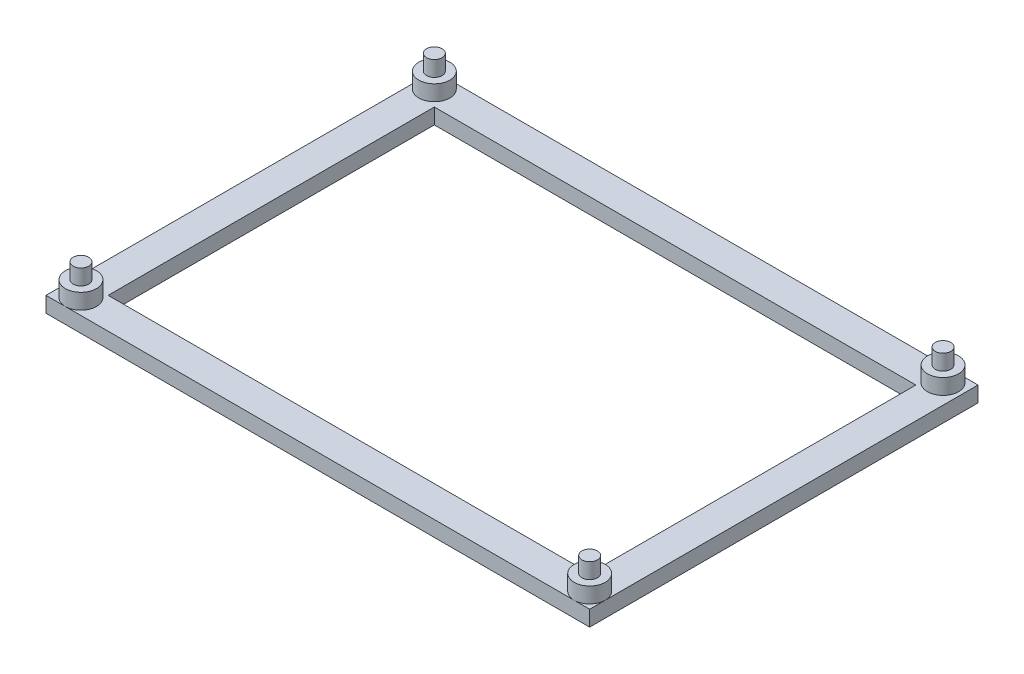
ISO-10303-21;
HEADER;
FILE_DESCRIPTION(('STEP AP214'),'2;1');
FILE_NAME('part.step','',(''),(''),'','','');
FILE_SCHEMA(('AUTOMOTIVE_DESIGN { 1 0 10303 214 1 1 1 1 }'));
ENDSEC;
DATA;
#1=APPLICATION_CONTEXT('core data for automotive mechanical design processes');
#2=APPLICATION_PROTOCOL_DEFINITION('international standard','automotive_design',2000,#1);
#3=PRODUCT_CONTEXT('',#1,'mechanical');
#4=PRODUCT('Part','Part','',(#3));
#5=PRODUCT_RELATED_PRODUCT_CATEGORY('part','',(#4));
#6=PRODUCT_DEFINITION_FORMATION('','',#4);
#7=PRODUCT_DEFINITION_CONTEXT('part definition',#1,'design');
#8=PRODUCT_DEFINITION('design','',#6,#7);
#9=PRODUCT_DEFINITION_SHAPE('','',#8);
#10=(LENGTH_UNIT() NAMED_UNIT(*) SI_UNIT(.MILLI.,.METRE.));
#11=(NAMED_UNIT(*) PLANE_ANGLE_UNIT() SI_UNIT($,.RADIAN.));
#12=(NAMED_UNIT(*) SI_UNIT($,.STERADIAN.) SOLID_ANGLE_UNIT());
#13=UNCERTAINTY_MEASURE_WITH_UNIT(LENGTH_MEASURE(1.E-05),#10,'distance_accuracy_value','');
#14=(GEOMETRIC_REPRESENTATION_CONTEXT(3) GLOBAL_UNCERTAINTY_ASSIGNED_CONTEXT((#13)) GLOBAL_UNIT_ASSIGNED_CONTEXT((#10,
#11,#12)) REPRESENTATION_CONTEXT('',''));
#15=CARTESIAN_POINT('',(0.,0.,0.));
#16=DIRECTION('',(0.,0.,1.));
#17=DIRECTION('',(1.,0.,0.));
#18=AXIS2_PLACEMENT_3D('',#15,#16,#17);
#19=CARTESIAN_POINT('',(0.,2.,0.));
#20=DIRECTION('',(0.,-1.,0.));
#21=DIRECTION('',(0.,0.,-1.));
#22=AXIS2_PLACEMENT_3D('',#19,#20,#21);
#23=PLANE('',#22);
#24=CARTESIAN_POINT('',(33.,2.,23.));
#25=DIRECTION('',(0.,1.,0.));
#26=DIRECTION('',(0.,0.,1.));
#27=AXIS2_PLACEMENT_3D('',#24,#25,#26);
#28=CIRCLE('',#27,2.);
#29=CARTESIAN_POINT('',(33.,2.,25.));
#30=VERTEX_POINT('',#29);
#31=CARTESIAN_POINT('',(35.,2.,23.));
#32=VERTEX_POINT('',#31);
#33=EDGE_CURVE('E188',#30,#32,#28,.T.);
#34=ORIENTED_EDGE('',*,*,#33,.F.);
#35=DIRECTION('',(1.,0.,0.));
#36=VECTOR('',#35,1.);
#37=CARTESIAN_POINT('',(-35.,2.,25.));
#38=LINE('',#37,#36);
#39=CARTESIAN_POINT('',(35.,2.,25.));
#40=VERTEX_POINT('',#39);
#41=EDGE_CURVE('E244',#30,#40,#38,.T.);
#42=ORIENTED_EDGE('',*,*,#41,.T.);
#43=DIRECTION('',(0.,0.,-1.));
#44=VECTOR('',#43,1.);
#45=CARTESIAN_POINT('',(35.,2.,25.));
#46=LINE('',#45,#44);
#47=EDGE_CURVE('E229',#40,#32,#46,.T.);
#48=ORIENTED_EDGE('',*,*,#47,.T.);
#49=EDGE_LOOP('',(#34,#42,#48));
#50=FACE_BOUND('',#49,.T.);
#51=ADVANCED_FACE('F41',(#50),#23,.F.);
#52=CARTESIAN_POINT('',(-33.,2.,-23.));
#53=DIRECTION('',(0.,1.,0.));
#54=DIRECTION('',(0.,0.,1.));
#55=AXIS2_PLACEMENT_3D('',#52,#53,#54);
#56=CIRCLE('',#55,2.);
#57=CARTESIAN_POINT('',(-33.,2.,-25.));
#58=VERTEX_POINT('',#57);
#59=CARTESIAN_POINT('',(-35.,2.,-23.));
#60=VERTEX_POINT('',#59);
#61=EDGE_CURVE('E207',#58,#60,#56,.T.);
#62=ORIENTED_EDGE('',*,*,#61,.F.);
#63=DIRECTION('',(-1.,0.,0.));
#64=VECTOR('',#63,1.);
#65=CARTESIAN_POINT('',(-35.,2.,-25.));
#66=LINE('',#65,#64);
#67=CARTESIAN_POINT('',(-35.,2.,-25.));
#68=VERTEX_POINT('',#67);
#69=EDGE_CURVE('E233',#58,#68,#66,.T.);
#70=ORIENTED_EDGE('',*,*,#69,.T.);
#71=DIRECTION('',(0.,0.,1.));
#72=VECTOR('',#71,1.);
#73=CARTESIAN_POINT('',(-35.,2.,25.));
#74=LINE('',#73,#72);
#75=EDGE_CURVE('E240',#68,#60,#74,.T.);
#76=ORIENTED_EDGE('',*,*,#75,.T.);
#77=EDGE_LOOP('',(#62,#70,#76));
#78=FACE_BOUND('',#77,.T.);
#79=ADVANCED_FACE('F327',(#78),#23,.F.);
#80=CARTESIAN_POINT('',(35.,2.,25.));
#81=DIRECTION('',(-1.,0.,0.));
#82=DIRECTION('',(0.,0.,1.));
#83=AXIS2_PLACEMENT_3D('',#80,#81,#82);
#84=PLANE('',#83);
#85=DIRECTION('',(0.,0.,-1.));
#86=VECTOR('',#85,1.);
#87=CARTESIAN_POINT('',(35.,0.,25.));
#88=LINE('',#87,#86);
#89=CARTESIAN_POINT('',(35.,0.,25.));
#90=VERTEX_POINT('',#89);
#91=CARTESIAN_POINT('',(35.,0.,-25.));
#92=VERTEX_POINT('',#91);
#93=EDGE_CURVE('E228',#90,#92,#88,.T.);
#94=ORIENTED_EDGE('',*,*,#93,.T.);
#95=DIRECTION('',(0.,-1.,0.));
#96=VECTOR('',#95,1.);
#97=CARTESIAN_POINT('',(35.,2.,-25.));
#98=LINE('',#97,#96);
#99=CARTESIAN_POINT('',(35.,2.,-25.));
#100=VERTEX_POINT('',#99);
#101=EDGE_CURVE('E11',#100,#92,#98,.T.);
#102=ORIENTED_EDGE('',*,*,#101,.F.);
#103=EDGE_CURVE('E234',#32,#100,#46,.T.);
#104=ORIENTED_EDGE('',*,*,#103,.F.);
#105=ORIENTED_EDGE('',*,*,#47,.F.);
#106=DIRECTION('',(0.,-1.,0.));
#107=VECTOR('',#106,1.);
#108=CARTESIAN_POINT('',(35.,2.,25.));
#109=LINE('',#108,#107);
#110=EDGE_CURVE('E248',#40,#90,#109,.T.);
#111=ORIENTED_EDGE('',*,*,#110,.T.);
#112=EDGE_LOOP('',(#94,#102,#104,#105,#111));
#113=FACE_BOUND('',#112,.T.);
#114=ADVANCED_FACE('F43',(#113),#84,.F.);
#115=CARTESIAN_POINT('',(-35.,2.,-25.));
#116=DIRECTION('',(0.,0.,1.));
#117=DIRECTION('',(1.,0.,0.));
#118=AXIS2_PLACEMENT_3D('',#115,#116,#117);
#119=PLANE('',#118);
#120=DIRECTION('',(-1.,0.,0.));
#121=VECTOR('',#120,1.);
#122=CARTESIAN_POINT('',(-35.,0.,-25.));
#123=LINE('',#122,#121);
#124=CARTESIAN_POINT('',(-35.,0.,-25.));
#125=VERTEX_POINT('',#124);
#126=EDGE_CURVE('E253',#92,#125,#123,.T.);
#127=ORIENTED_EDGE('',*,*,#126,.T.);
#128=DIRECTION('',(0.,-1.,0.));
#129=VECTOR('',#128,1.);
#130=CARTESIAN_POINT('',(-35.,2.,-25.));
#131=LINE('',#130,#129);
#132=EDGE_CURVE('E51',#68,#125,#131,.T.);
#133=ORIENTED_EDGE('',*,*,#132,.F.);
#134=ORIENTED_EDGE('',*,*,#69,.F.);
#135=CARTESIAN_POINT('',(32.5,2.,-25.));
#136=VERTEX_POINT('',#135);
#137=EDGE_CURVE('E239',#136,#58,#66,.T.);
#138=ORIENTED_EDGE('',*,*,#137,.F.);
#139=EDGE_CURVE('E235',#100,#136,#66,.T.);
#140=ORIENTED_EDGE('',*,*,#139,.F.);
#141=ORIENTED_EDGE('',*,*,#101,.T.);
#142=EDGE_LOOP('',(#127,#133,#134,#138,#140,#141));
#143=FACE_BOUND('',#142,.T.);
#144=ADVANCED_FACE('F330',(#143),#119,.F.);
#145=CARTESIAN_POINT('',(-35.,2.,25.));
#146=DIRECTION('',(1.,0.,0.));
#147=DIRECTION('',(0.,0.,-1.));
#148=AXIS2_PLACEMENT_3D('',#145,#146,#147);
#149=PLANE('',#148);
#150=DIRECTION('',(0.,0.,1.));
#151=VECTOR('',#150,1.);
#152=CARTESIAN_POINT('',(-35.,0.,25.));
#153=LINE('',#152,#151);
#154=CARTESIAN_POINT('',(-35.,0.,25.));
#155=VERTEX_POINT('',#154);
#156=EDGE_CURVE('E256',#125,#155,#153,.T.);
#157=ORIENTED_EDGE('',*,*,#156,.T.);
#158=DIRECTION('',(0.,-1.,0.));
#159=VECTOR('',#158,1.);
#160=CARTESIAN_POINT('',(-35.,2.,25.));
#161=LINE('',#160,#159);
#162=CARTESIAN_POINT('',(-35.,2.,25.));
#163=VERTEX_POINT('',#162);
#164=EDGE_CURVE('E265',#163,#155,#161,.T.);
#165=ORIENTED_EDGE('',*,*,#164,.F.);
#166=EDGE_CURVE('E238',#60,#163,#74,.T.);
#167=ORIENTED_EDGE('',*,*,#166,.F.);
#168=ORIENTED_EDGE('',*,*,#75,.F.);
#169=ORIENTED_EDGE('',*,*,#132,.T.);
#170=EDGE_LOOP('',(#157,#165,#167,#168,#169));
#171=FACE_BOUND('',#170,.T.);
#172=ADVANCED_FACE('F323',(#171),#149,.F.);
#173=CARTESIAN_POINT('',(-35.,2.,25.));
#174=DIRECTION('',(0.,0.,-1.));
#175=DIRECTION('',(-1.,0.,0.));
#176=AXIS2_PLACEMENT_3D('',#173,#174,#175);
#177=PLANE('',#176);
#178=DIRECTION('',(1.,0.,0.));
#179=VECTOR('',#178,1.);
#180=CARTESIAN_POINT('',(-35.,0.,25.));
#181=LINE('',#180,#179);
#182=EDGE_CURVE('E259',#155,#90,#181,.T.);
#183=ORIENTED_EDGE('',*,*,#182,.T.);
#184=ORIENTED_EDGE('',*,*,#110,.F.);
#185=ORIENTED_EDGE('',*,*,#41,.F.);
#186=CARTESIAN_POINT('',(-32.5,2.,25.));
#187=VERTEX_POINT('',#186);
#188=EDGE_CURVE('E249',#187,#30,#38,.T.);
#189=ORIENTED_EDGE('',*,*,#188,.F.);
#190=EDGE_CURVE('E245',#163,#187,#38,.T.);
#191=ORIENTED_EDGE('',*,*,#190,.F.);
#192=ORIENTED_EDGE('',*,*,#164,.T.);
#193=EDGE_LOOP('',(#183,#184,#185,#189,#191,#192));
#194=FACE_BOUND('',#193,.T.);
#195=ADVANCED_FACE('F334',(#194),#177,.F.);
#196=DIRECTION('',(1.,0.,0.));
#197=VECTOR('',#196,1.);
#198=CARTESIAN_POINT('',(31.,2.,21.));
#199=LINE('',#198,#197);
#200=CARTESIAN_POINT('',(-31.,2.,21.));
#201=VERTEX_POINT('',#200);
#202=CARTESIAN_POINT('',(31.,2.,21.));
#203=VERTEX_POINT('',#202);
#204=EDGE_CURVE('E161',#201,#203,#199,.T.);
#205=ORIENTED_EDGE('',*,*,#204,.F.);
#206=DIRECTION('',(0.,0.,1.));
#207=VECTOR('',#206,1.);
#208=CARTESIAN_POINT('',(-31.,2.,21.));
#209=LINE('',#208,#207);
#210=CARTESIAN_POINT('',(-31.,2.,-21.));
#211=VERTEX_POINT('',#210);
#212=EDGE_CURVE('E59',#211,#201,#209,.T.);
#213=ORIENTED_EDGE('',*,*,#212,.F.);
#214=DIRECTION('',(-1.,0.,0.));
#215=VECTOR('',#214,1.);
#216=CARTESIAN_POINT('',(31.,2.,-21.));
#217=LINE('',#216,#215);
#218=CARTESIAN_POINT('',(31.,2.,-21.));
#219=VERTEX_POINT('',#218);
#220=EDGE_CURVE('E148',#219,#211,#217,.T.);
#221=ORIENTED_EDGE('',*,*,#220,.F.);
#222=DIRECTION('',(0.,0.,-1.));
#223=VECTOR('',#222,1.);
#224=CARTESIAN_POINT('',(31.,2.,21.));
#225=LINE('',#224,#223);
#226=EDGE_CURVE('E152',#203,#219,#225,.T.);
#227=ORIENTED_EDGE('',*,*,#226,.F.);
#228=EDGE_LOOP('',(#205,#213,#221,#227));
#229=FACE_BOUND('',#228,.T.);
#230=ORIENTED_EDGE('',*,*,#190,.T.);
#231=CARTESIAN_POINT('',(-32.5,2.,23.));
#232=DIRECTION('',(0.,1.,0.));
#233=DIRECTION('',(0.,0.,1.));
#234=AXIS2_PLACEMENT_3D('',#231,#232,#233);
#235=CIRCLE('',#234,2.);
#236=EDGE_CURVE('E170',#187,#187,#235,.T.);
#237=ORIENTED_EDGE('',*,*,#236,.F.);
#238=ORIENTED_EDGE('',*,*,#188,.T.);
#239=EDGE_CURVE('E192',#32,#30,#28,.T.);
#240=ORIENTED_EDGE('',*,*,#239,.F.);
#241=ORIENTED_EDGE('',*,*,#103,.T.);
#242=ORIENTED_EDGE('',*,*,#139,.T.);
#243=CARTESIAN_POINT('',(32.5,2.,-23.));
#244=DIRECTION('',(0.,1.,0.));
#245=DIRECTION('',(0.,0.,1.));
#246=AXIS2_PLACEMENT_3D('',#243,#244,#245);
#247=CIRCLE('',#246,2.);
#248=EDGE_CURVE('E198',#136,#136,#247,.T.);
#249=ORIENTED_EDGE('',*,*,#248,.F.);
#250=ORIENTED_EDGE('',*,*,#137,.T.);
#251=EDGE_CURVE('E211',#60,#58,#56,.T.);
#252=ORIENTED_EDGE('',*,*,#251,.F.);
#253=ORIENTED_EDGE('',*,*,#166,.T.);
#254=EDGE_LOOP('',(#230,#237,#238,#240,#241,#242,#249,#250,#252,#253));
#255=FACE_BOUND('',#254,.T.);
#256=ADVANCED_FACE('F316',(#229,#255),#23,.F.);
#257=CARTESIAN_POINT('',(0.,0.,0.));
#258=DIRECTION('',(0.,-1.,0.));
#259=DIRECTION('',(0.,0.,-1.));
#260=AXIS2_PLACEMENT_3D('',#257,#258,#259);
#261=PLANE('',#260);
#262=DIRECTION('',(0.,0.,1.));
#263=VECTOR('',#262,1.);
#264=CARTESIAN_POINT('',(-31.,0.,21.));
#265=LINE('',#264,#263);
#266=CARTESIAN_POINT('',(-31.,0.,-21.));
#267=VERTEX_POINT('',#266);
#268=CARTESIAN_POINT('',(-31.,0.,21.));
#269=VERTEX_POINT('',#268);
#270=EDGE_CURVE('E129',#267,#269,#265,.T.);
#271=ORIENTED_EDGE('',*,*,#270,.T.);
#272=DIRECTION('',(1.,0.,0.));
#273=VECTOR('',#272,1.);
#274=CARTESIAN_POINT('',(31.,0.,21.));
#275=LINE('',#274,#273);
#276=CARTESIAN_POINT('',(31.,0.,21.));
#277=VERTEX_POINT('',#276);
#278=EDGE_CURVE('E139',#269,#277,#275,.T.);
#279=ORIENTED_EDGE('',*,*,#278,.T.);
#280=DIRECTION('',(0.,0.,-1.));
#281=VECTOR('',#280,1.);
#282=CARTESIAN_POINT('',(31.,0.,21.));
#283=LINE('',#282,#281);
#284=CARTESIAN_POINT('',(31.,0.,-21.));
#285=VERTEX_POINT('',#284);
#286=EDGE_CURVE('E67',#277,#285,#283,.T.);
#287=ORIENTED_EDGE('',*,*,#286,.T.);
#288=DIRECTION('',(-1.,0.,0.));
#289=VECTOR('',#288,1.);
#290=CARTESIAN_POINT('',(31.,0.,-21.));
#291=LINE('',#290,#289);
#292=EDGE_CURVE('E136',#285,#267,#291,.T.);
#293=ORIENTED_EDGE('',*,*,#292,.T.);
#294=EDGE_LOOP('',(#271,#279,#287,#293));
#295=FACE_BOUND('',#294,.T.);
#296=ORIENTED_EDGE('',*,*,#93,.F.);
#297=ORIENTED_EDGE('',*,*,#182,.F.);
#298=ORIENTED_EDGE('',*,*,#156,.F.);
#299=ORIENTED_EDGE('',*,*,#126,.F.);
#300=EDGE_LOOP('',(#296,#297,#298,#299));
#301=FACE_BOUND('',#300,.T.);
#302=ADVANCED_FACE('F144',(#295,#301),#261,.T.);
#303=CARTESIAN_POINT('',(-33.,4.,-23.));
#304=DIRECTION('',(0.,-1.,0.));
#305=DIRECTION('',(0.,0.,-1.));
#306=AXIS2_PLACEMENT_3D('',#303,#304,#305);
#307=CYLINDRICAL_SURFACE('',#306,2.);
#308=CARTESIAN_POINT('',(-33.,4.,-23.));
#309=DIRECTION('',(0.,1.,0.));
#310=DIRECTION('',(0.,0.,1.));
#311=AXIS2_PLACEMENT_3D('',#308,#309,#310);
#312=CIRCLE('',#311,2.);
#313=CARTESIAN_POINT('',(-33.,4.,-21.));
#314=VERTEX_POINT('',#313);
#315=EDGE_CURVE('E202',#314,#314,#312,.T.);
#316=ORIENTED_EDGE('',*,*,#315,.F.);
#317=EDGE_LOOP('',(#316));
#318=FACE_BOUND('',#317,.T.);
#319=ORIENTED_EDGE('',*,*,#61,.T.);
#320=ORIENTED_EDGE('',*,*,#251,.T.);
#321=EDGE_LOOP('',(#319,#320));
#322=FACE_BOUND('',#321,.T.);
#323=ADVANCED_FACE('F313',(#318,#322),#307,.T.);
#324=CARTESIAN_POINT('',(-33.,4.,-23.));
#325=DIRECTION('',(0.,1.,0.));
#326=DIRECTION('',(0.,0.,1.));
#327=AXIS2_PLACEMENT_3D('',#324,#325,#326);
#328=PLANE('',#327);
#329=CARTESIAN_POINT('',(-33.,4.,-23.));
#330=DIRECTION('',(0.,1.,0.));
#331=DIRECTION('',(0.,0.,1.));
#332=AXIS2_PLACEMENT_3D('',#329,#330,#331);
#333=CIRCLE('',#332,0.999999999999998);
#334=CARTESIAN_POINT('',(-33.,4.,-22.));
#335=VERTEX_POINT('',#334);
#336=EDGE_CURVE('E206',#335,#335,#333,.T.);
#337=ORIENTED_EDGE('',*,*,#336,.F.);
#338=EDGE_LOOP('',(#337));
#339=FACE_BOUND('',#338,.T.);
#340=ORIENTED_EDGE('',*,*,#315,.T.);
#341=EDGE_LOOP('',(#340));
#342=FACE_BOUND('',#341,.T.);
#343=ADVANCED_FACE('F501',(#339,#342),#328,.T.);
#344=CARTESIAN_POINT('',(0.,6.,0.));
#345=DIRECTION('',(0.,1.,0.));
#346=DIRECTION('',(0.,0.,1.));
#347=AXIS2_PLACEMENT_3D('',#344,#345,#346);
#348=PLANE('',#347);
#349=CARTESIAN_POINT('',(-33.,6.,-23.));
#350=DIRECTION('',(0.,1.,0.));
#351=DIRECTION('',(0.,0.,1.));
#352=AXIS2_PLACEMENT_3D('',#349,#350,#351);
#353=CIRCLE('',#352,0.999999999999998);
#354=CARTESIAN_POINT('',(-33.,6.,-22.));
#355=VERTEX_POINT('',#354);
#356=EDGE_CURVE('E220',#355,#355,#353,.T.);
#357=ORIENTED_EDGE('',*,*,#356,.T.);
#358=EDGE_LOOP('',(#357));
#359=FACE_BOUND('',#358,.T.);
#360=ADVANCED_FACE('F494',(#359),#348,.T.);
#361=CARTESIAN_POINT('',(-33.,6.,-23.));
#362=DIRECTION('',(0.,-1.,0.));
#363=DIRECTION('',(0.,0.,-1.));
#364=AXIS2_PLACEMENT_3D('',#361,#362,#363);
#365=CYLINDRICAL_SURFACE('',#364,0.999999999999998);
#366=ORIENTED_EDGE('',*,*,#336,.T.);
#367=EDGE_LOOP('',(#366));
#368=FACE_BOUND('',#367,.T.);
#369=ORIENTED_EDGE('',*,*,#356,.F.);
#370=EDGE_LOOP('',(#369));
#371=FACE_BOUND('',#370,.T.);
#372=ADVANCED_FACE('F483',(#368,#371),#365,.T.);
#373=CARTESIAN_POINT('',(32.5,4.,-23.));
#374=DIRECTION('',(0.,-1.,0.));
#375=DIRECTION('',(0.,0.,-1.));
#376=AXIS2_PLACEMENT_3D('',#373,#374,#375);
#377=CYLINDRICAL_SURFACE('',#376,2.);
#378=CARTESIAN_POINT('',(32.5,4.,-23.));
#379=DIRECTION('',(0.,1.,0.));
#380=DIRECTION('',(0.,0.,1.));
#381=AXIS2_PLACEMENT_3D('',#378,#379,#380);
#382=CIRCLE('',#381,2.);
#383=CARTESIAN_POINT('',(32.5,4.,-21.));
#384=VERTEX_POINT('',#383);
#385=EDGE_CURVE('E193',#384,#384,#382,.T.);
#386=ORIENTED_EDGE('',*,*,#385,.F.);
#387=EDGE_LOOP('',(#386));
#388=FACE_BOUND('',#387,.T.);
#389=ORIENTED_EDGE('',*,*,#248,.T.);
#390=EDGE_LOOP('',(#389));
#391=FACE_BOUND('',#390,.T.);
#392=ADVANCED_FACE('F473',(#388,#391),#377,.T.);
#393=CARTESIAN_POINT('',(32.5,4.,-23.));
#394=DIRECTION('',(0.,1.,0.));
#395=DIRECTION('',(0.,0.,1.));
#396=AXIS2_PLACEMENT_3D('',#393,#394,#395);
#397=PLANE('',#396);
#398=CARTESIAN_POINT('',(32.5,4.,-23.));
#399=DIRECTION('',(0.,1.,0.));
#400=DIRECTION('',(0.,0.,1.));
#401=AXIS2_PLACEMENT_3D('',#398,#399,#400);
#402=CIRCLE('',#401,0.999999999999998);
#403=CARTESIAN_POINT('',(32.5,4.,-22.));
#404=VERTEX_POINT('',#403);
#405=EDGE_CURVE('E197',#404,#404,#402,.T.);
#406=ORIENTED_EDGE('',*,*,#405,.F.);
#407=EDGE_LOOP('',(#406));
#408=FACE_BOUND('',#407,.T.);
#409=ORIENTED_EDGE('',*,*,#385,.T.);
#410=EDGE_LOOP('',(#409));
#411=FACE_BOUND('',#410,.T.);
#412=ADVANCED_FACE('F469',(#408,#411),#397,.T.);
#413=CARTESIAN_POINT('',(0.,6.,0.));
#414=DIRECTION('',(0.,1.,0.));
#415=DIRECTION('',(0.,0.,1.));
#416=AXIS2_PLACEMENT_3D('',#413,#414,#415);
#417=PLANE('',#416);
#418=CARTESIAN_POINT('',(32.5,6.,-23.));
#419=DIRECTION('',(0.,1.,0.));
#420=DIRECTION('',(0.,0.,1.));
#421=AXIS2_PLACEMENT_3D('',#418,#419,#420);
#422=CIRCLE('',#421,0.999999999999998);
#423=CARTESIAN_POINT('',(32.5,6.,-22.));
#424=VERTEX_POINT('',#423);
#425=EDGE_CURVE('E216',#424,#424,#422,.T.);
#426=ORIENTED_EDGE('',*,*,#425,.T.);
#427=EDGE_LOOP('',(#426));
#428=FACE_BOUND('',#427,.T.);
#429=ADVANCED_FACE('F461',(#428),#417,.T.);
#430=CARTESIAN_POINT('',(32.5,6.,-23.));
#431=DIRECTION('',(0.,-1.,0.));
#432=DIRECTION('',(0.,0.,-1.));
#433=AXIS2_PLACEMENT_3D('',#430,#431,#432);
#434=CYLINDRICAL_SURFACE('',#433,0.999999999999998);
#435=ORIENTED_EDGE('',*,*,#405,.T.);
#436=EDGE_LOOP('',(#435));
#437=FACE_BOUND('',#436,.T.);
#438=ORIENTED_EDGE('',*,*,#425,.F.);
#439=EDGE_LOOP('',(#438));
#440=FACE_BOUND('',#439,.T.);
#441=ADVANCED_FACE('F294',(#437,#440),#434,.T.);
#442=CARTESIAN_POINT('',(33.,4.,23.));
#443=DIRECTION('',(0.,-1.,0.));
#444=DIRECTION('',(0.,0.,-1.));
#445=AXIS2_PLACEMENT_3D('',#442,#443,#444);
#446=CYLINDRICAL_SURFACE('',#445,2.);
#447=CARTESIAN_POINT('',(33.,4.,23.));
#448=DIRECTION('',(0.,1.,0.));
#449=DIRECTION('',(0.,0.,1.));
#450=AXIS2_PLACEMENT_3D('',#447,#448,#449);
#451=CIRCLE('',#450,2.);
#452=CARTESIAN_POINT('',(33.,4.,25.));
#453=VERTEX_POINT('',#452);
#454=EDGE_CURVE('E183',#453,#453,#451,.T.);
#455=ORIENTED_EDGE('',*,*,#454,.F.);
#456=EDGE_LOOP('',(#455));
#457=FACE_BOUND('',#456,.T.);
#458=ORIENTED_EDGE('',*,*,#33,.T.);
#459=ORIENTED_EDGE('',*,*,#239,.T.);
#460=EDGE_LOOP('',(#458,#459));
#461=FACE_BOUND('',#460,.T.);
#462=ADVANCED_FACE('F288',(#457,#461),#446,.T.);
#463=CARTESIAN_POINT('',(33.,4.,23.));
#464=DIRECTION('',(0.,1.,0.));
#465=DIRECTION('',(0.,0.,1.));
#466=AXIS2_PLACEMENT_3D('',#463,#464,#465);
#467=PLANE('',#466);
#468=CARTESIAN_POINT('',(33.,4.,23.));
#469=DIRECTION('',(0.,1.,0.));
#470=DIRECTION('',(0.,0.,1.));
#471=AXIS2_PLACEMENT_3D('',#468,#469,#470);
#472=CIRCLE('',#471,0.999999999999998);
#473=CARTESIAN_POINT('',(33.,4.,24.));
#474=VERTEX_POINT('',#473);
#475=EDGE_CURVE('E187',#474,#474,#472,.T.);
#476=ORIENTED_EDGE('',*,*,#475,.F.);
#477=EDGE_LOOP('',(#476));
#478=FACE_BOUND('',#477,.T.);
#479=ORIENTED_EDGE('',*,*,#454,.T.);
#480=EDGE_LOOP('',(#479));
#481=FACE_BOUND('',#480,.T.);
#482=ADVANCED_FACE('F284',(#478,#481),#467,.T.);
#483=CARTESIAN_POINT('',(33.,6.,23.));
#484=DIRECTION('',(0.,1.,0.));
#485=DIRECTION('',(0.,0.,1.));
#486=AXIS2_PLACEMENT_3D('',#483,#484,#485);
#487=PLANE('',#486);
#488=CARTESIAN_POINT('',(33.,6.,23.));
#489=DIRECTION('',(0.,1.,0.));
#490=DIRECTION('',(0.,0.,1.));
#491=AXIS2_PLACEMENT_3D('',#488,#489,#490);
#492=CIRCLE('',#491,0.999999999999998);
#493=CARTESIAN_POINT('',(33.,6.,24.));
#494=VERTEX_POINT('',#493);
#495=EDGE_CURVE('E212',#494,#494,#492,.T.);
#496=ORIENTED_EDGE('',*,*,#495,.T.);
#497=EDGE_LOOP('',(#496));
#498=FACE_BOUND('',#497,.T.);
#499=ADVANCED_FACE('F287',(#498),#487,.T.);
#500=CARTESIAN_POINT('',(33.,6.,23.));
#501=DIRECTION('',(0.,-1.,0.));
#502=DIRECTION('',(0.,0.,-1.));
#503=AXIS2_PLACEMENT_3D('',#500,#501,#502);
#504=CYLINDRICAL_SURFACE('',#503,0.999999999999998);
#505=ORIENTED_EDGE('',*,*,#475,.T.);
#506=EDGE_LOOP('',(#505));
#507=FACE_BOUND('',#506,.T.);
#508=ORIENTED_EDGE('',*,*,#495,.F.);
#509=EDGE_LOOP('',(#508));
#510=FACE_BOUND('',#509,.T.);
#511=ADVANCED_FACE('F281',(#507,#510),#504,.T.);
#512=CARTESIAN_POINT('',(-32.5,4.,23.));
#513=DIRECTION('',(0.,-1.,0.));
#514=DIRECTION('',(0.,0.,-1.));
#515=AXIS2_PLACEMENT_3D('',#512,#513,#514);
#516=CYLINDRICAL_SURFACE('',#515,2.);
#517=CARTESIAN_POINT('',(-32.5,4.,23.));
#518=DIRECTION('',(0.,1.,0.));
#519=DIRECTION('',(0.,0.,1.));
#520=AXIS2_PLACEMENT_3D('',#517,#518,#519);
#521=CIRCLE('',#520,2.);
#522=CARTESIAN_POINT('',(-32.5,4.,25.));
#523=VERTEX_POINT('',#522);
#524=EDGE_CURVE('E176',#523,#523,#521,.T.);
#525=ORIENTED_EDGE('',*,*,#524,.F.);
#526=EDGE_LOOP('',(#525));
#527=FACE_BOUND('',#526,.T.);
#528=ORIENTED_EDGE('',*,*,#236,.T.);
#529=EDGE_LOOP('',(#528));
#530=FACE_BOUND('',#529,.T.);
#531=ADVANCED_FACE('F338',(#527,#530),#516,.T.);
#532=CARTESIAN_POINT('',(-32.5,4.,23.));
#533=DIRECTION('',(0.,1.,0.));
#534=DIRECTION('',(0.,0.,1.));
#535=AXIS2_PLACEMENT_3D('',#532,#533,#534);
#536=PLANE('',#535);
#537=CARTESIAN_POINT('',(-32.5,4.,23.));
#538=DIRECTION('',(0.,1.,0.));
#539=DIRECTION('',(0.,0.,1.));
#540=AXIS2_PLACEMENT_3D('',#537,#538,#539);
#541=CIRCLE('',#540,0.999999999999998);
#542=CARTESIAN_POINT('',(-32.5,4.,24.));
#543=VERTEX_POINT('',#542);
#544=EDGE_CURVE('E45',#543,#543,#541,.T.);
#545=ORIENTED_EDGE('',*,*,#544,.F.);
#546=EDGE_LOOP('',(#545));
#547=FACE_BOUND('',#546,.T.);
#548=ORIENTED_EDGE('',*,*,#524,.T.);
#549=EDGE_LOOP('',(#548));
#550=FACE_BOUND('',#549,.T.);
#551=ADVANCED_FACE('F340',(#547,#550),#536,.T.);
#552=CARTESIAN_POINT('',(0.,6.,0.));
#553=DIRECTION('',(0.,1.,0.));
#554=DIRECTION('',(0.,0.,1.));
#555=AXIS2_PLACEMENT_3D('',#552,#553,#554);
#556=PLANE('',#555);
#557=CARTESIAN_POINT('',(-32.5,6.,23.));
#558=DIRECTION('',(0.,1.,0.));
#559=DIRECTION('',(0.,0.,1.));
#560=AXIS2_PLACEMENT_3D('',#557,#558,#559);
#561=CIRCLE('',#560,0.999999999999998);
#562=CARTESIAN_POINT('',(-32.5,6.,24.));
#563=VERTEX_POINT('',#562);
#564=EDGE_CURVE('E224',#563,#563,#561,.T.);
#565=ORIENTED_EDGE('',*,*,#564,.T.);
#566=EDGE_LOOP('',(#565));
#567=FACE_BOUND('',#566,.T.);
#568=ADVANCED_FACE('F347',(#567),#556,.T.);
#569=CARTESIAN_POINT('',(-32.5,6.,23.));
#570=DIRECTION('',(0.,-1.,0.));
#571=DIRECTION('',(0.,0.,-1.));
#572=AXIS2_PLACEMENT_3D('',#569,#570,#571);
#573=CYLINDRICAL_SURFACE('',#572,0.999999999999998);
#574=ORIENTED_EDGE('',*,*,#544,.T.);
#575=EDGE_LOOP('',(#574));
#576=FACE_BOUND('',#575,.T.);
#577=ORIENTED_EDGE('',*,*,#564,.F.);
#578=EDGE_LOOP('',(#577));
#579=FACE_BOUND('',#578,.T.);
#580=ADVANCED_FACE('F378',(#576,#579),#573,.T.);
#581=CARTESIAN_POINT('',(-31.,0.,21.));
#582=DIRECTION('',(-1.,0.,0.));
#583=DIRECTION('',(0.,0.,1.));
#584=AXIS2_PLACEMENT_3D('',#581,#582,#583);
#585=PLANE('',#584);
#586=ORIENTED_EDGE('',*,*,#212,.T.);
#587=DIRECTION('',(0.,1.,0.));
#588=VECTOR('',#587,1.);
#589=CARTESIAN_POINT('',(-31.,0.,21.));
#590=LINE('',#589,#588);
#591=EDGE_CURVE('E125',#269,#201,#590,.T.);
#592=ORIENTED_EDGE('',*,*,#591,.F.);
#593=ORIENTED_EDGE('',*,*,#270,.F.);
#594=DIRECTION('',(0.,1.,0.));
#595=VECTOR('',#594,1.);
#596=CARTESIAN_POINT('',(-31.,0.,-21.));
#597=LINE('',#596,#595);
#598=EDGE_CURVE('E167',#267,#211,#597,.T.);
#599=ORIENTED_EDGE('',*,*,#598,.T.);
#600=EDGE_LOOP('',(#586,#592,#593,#599));
#601=FACE_BOUND('',#600,.T.);
#602=ADVANCED_FACE('F127',(#601),#585,.F.);
#603=CARTESIAN_POINT('',(31.,0.,-21.));
#604=DIRECTION('',(0.,0.,-1.));
#605=DIRECTION('',(-1.,0.,0.));
#606=AXIS2_PLACEMENT_3D('',#603,#604,#605);
#607=PLANE('',#606);
#608=ORIENTED_EDGE('',*,*,#220,.T.);
#609=ORIENTED_EDGE('',*,*,#598,.F.);
#610=ORIENTED_EDGE('',*,*,#292,.F.);
#611=DIRECTION('',(0.,1.,0.));
#612=VECTOR('',#611,1.);
#613=CARTESIAN_POINT('',(31.,0.,-21.));
#614=LINE('',#613,#612);
#615=EDGE_CURVE('E171',#285,#219,#614,.T.);
#616=ORIENTED_EDGE('',*,*,#615,.T.);
#617=EDGE_LOOP('',(#608,#609,#610,#616));
#618=FACE_BOUND('',#617,.T.);
#619=ADVANCED_FACE('F370',(#618),#607,.F.);
#620=CARTESIAN_POINT('',(31.,0.,21.));
#621=DIRECTION('',(1.,0.,0.));
#622=DIRECTION('',(0.,0.,-1.));
#623=AXIS2_PLACEMENT_3D('',#620,#621,#622);
#624=PLANE('',#623);
#625=ORIENTED_EDGE('',*,*,#226,.T.);
#626=ORIENTED_EDGE('',*,*,#615,.F.);
#627=ORIENTED_EDGE('',*,*,#286,.F.);
#628=DIRECTION('',(0.,1.,0.));
#629=VECTOR('',#628,1.);
#630=CARTESIAN_POINT('',(31.,0.,21.));
#631=LINE('',#630,#629);
#632=EDGE_CURVE('E135',#277,#203,#631,.T.);
#633=ORIENTED_EDGE('',*,*,#632,.T.);
#634=EDGE_LOOP('',(#625,#626,#627,#633));
#635=FACE_BOUND('',#634,.T.);
#636=ADVANCED_FACE('F368',(#635),#624,.F.);
#637=CARTESIAN_POINT('',(31.,0.,21.));
#638=DIRECTION('',(0.,0.,1.));
#639=DIRECTION('',(1.,0.,0.));
#640=AXIS2_PLACEMENT_3D('',#637,#638,#639);
#641=PLANE('',#640);
#642=ORIENTED_EDGE('',*,*,#204,.T.);
#643=ORIENTED_EDGE('',*,*,#632,.F.);
#644=ORIENTED_EDGE('',*,*,#278,.F.);
#645=ORIENTED_EDGE('',*,*,#591,.T.);
#646=EDGE_LOOP('',(#642,#643,#644,#645));
#647=FACE_BOUND('',#646,.T.);
#648=ADVANCED_FACE('F140',(#647),#641,.F.);
#649=CLOSED_SHELL('',(#51,#79,#114,#144,#172,#195,#256,#302,#323,#343,#360,#372,#392,#412,#429,
#441,#462,#482,#499,#511,#531,#551,#568,#580,#602,#619,#636,#648));
#650=MANIFOLD_SOLID_BREP('B2',#649);
#651=ADVANCED_BREP_SHAPE_REPRESENTATION('',(#18,#650),#14);
#652=SHAPE_DEFINITION_REPRESENTATION(#9,#651);
ENDSEC;
END-ISO-10303-21;
